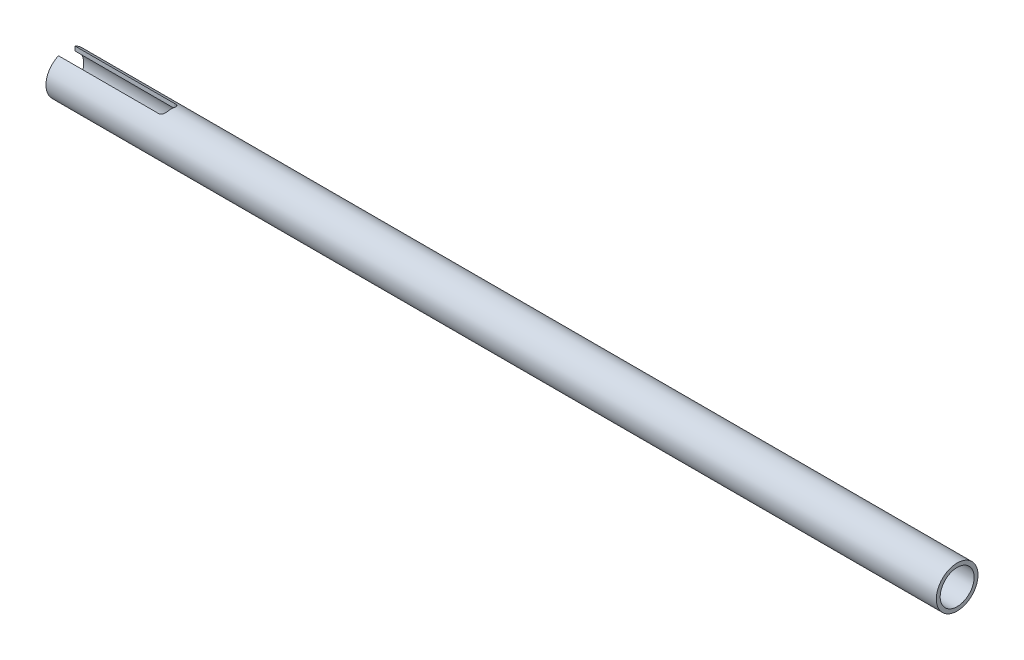
ISO-10303-21;
HEADER;
FILE_DESCRIPTION(('STEP AP214'),'2;1');
FILE_NAME('part.step','',(''),(''),'','','');
FILE_SCHEMA(('AUTOMOTIVE_DESIGN { 1 0 10303 214 1 1 1 1 }'));
ENDSEC;
DATA;
#1=APPLICATION_CONTEXT('core data for automotive mechanical design processes');
#2=APPLICATION_PROTOCOL_DEFINITION('international standard','automotive_design',2000,#1);
#3=PRODUCT_CONTEXT('',#1,'mechanical');
#4=PRODUCT('Part','Part','',(#3));
#5=PRODUCT_RELATED_PRODUCT_CATEGORY('part','',(#4));
#6=PRODUCT_DEFINITION_FORMATION('','',#4);
#7=PRODUCT_DEFINITION_CONTEXT('part definition',#1,'design');
#8=PRODUCT_DEFINITION('design','',#6,#7);
#9=PRODUCT_DEFINITION_SHAPE('','',#8);
#10=(LENGTH_UNIT() NAMED_UNIT(*) SI_UNIT(.MILLI.,.METRE.));
#11=(NAMED_UNIT(*) PLANE_ANGLE_UNIT() SI_UNIT($,.RADIAN.));
#12=(NAMED_UNIT(*) SI_UNIT($,.STERADIAN.) SOLID_ANGLE_UNIT());
#13=UNCERTAINTY_MEASURE_WITH_UNIT(LENGTH_MEASURE(1.E-05),#10,'distance_accuracy_value','');
#14=(GEOMETRIC_REPRESENTATION_CONTEXT(3) GLOBAL_UNCERTAINTY_ASSIGNED_CONTEXT((#13)) GLOBAL_UNIT_ASSIGNED_CONTEXT((#10,
#11,#12)) REPRESENTATION_CONTEXT('',''));
#15=CARTESIAN_POINT('',(0.,0.,0.));
#16=DIRECTION('',(0.,0.,1.));
#17=DIRECTION('',(1.,0.,0.));
#18=AXIS2_PLACEMENT_3D('',#15,#16,#17);
#19=CARTESIAN_POINT('',(-146.220291484198,4.26481936978211E-13,4.76249999999974));
#20=DIRECTION('',(-1.,0.,0.));
#21=DIRECTION('',(0.,-1.,0.));
#22=AXIS2_PLACEMENT_3D('',#19,#20,#21);
#23=PLANE('',#22);
#24=DIRECTION('',(0.,1.,0.));
#25=VECTOR('',#24,1.);
#26=CARTESIAN_POINT('',(-146.220291484198,4.26470921484139E-13,3.17499999999998));
#27=LINE('',#26,#25);
#28=CARTESIAN_POINT('',(-146.220291484198,-7.2748389157424,3.17499999999998));
#29=VERTEX_POINT('',#28);
#30=CARTESIAN_POINT('',(-146.220291484198,-5.63085690548074,3.17499999999998));
#31=VERTEX_POINT('',#30);
#32=EDGE_CURVE('E219',#29,#31,#27,.T.);
#33=ORIENTED_EDGE('',*,*,#32,.F.);
#34=CARTESIAN_POINT('',(-146.220291484198,0.,0.));
#35=DIRECTION('',(-1.,0.,0.));
#36=DIRECTION('',(0.,-1.,0.));
#37=AXIS2_PLACEMENT_3D('',#34,#35,#36);
#38=CIRCLE('',#37,7.9375);
#39=CARTESIAN_POINT('',(-146.220291484198,7.2748389157424,3.17499999999998));
#40=VERTEX_POINT('',#39);
#41=EDGE_CURVE('E202',#40,#29,#38,.F.);
#42=ORIENTED_EDGE('',*,*,#41,.F.);
#43=CARTESIAN_POINT('',(-146.220291484198,5.63085690548074,3.17499999999998));
#44=VERTEX_POINT('',#43);
#45=EDGE_CURVE('E218',#44,#40,#27,.T.);
#46=ORIENTED_EDGE('',*,*,#45,.F.);
#47=CARTESIAN_POINT('',(-146.220291484198,0.,0.));
#48=DIRECTION('',(-1.,0.,0.));
#49=DIRECTION('',(0.,-1.,0.));
#50=AXIS2_PLACEMENT_3D('',#47,#48,#49);
#51=CIRCLE('',#50,6.4643);
#52=EDGE_CURVE('E207',#44,#31,#51,.F.);
#53=ORIENTED_EDGE('',*,*,#52,.T.);
#54=EDGE_LOOP('',(#33,#42,#46,#53));
#55=FACE_BOUND('',#54,.T.);
#56=ADVANCED_FACE('F36',(#55),#23,.T.);
#57=CARTESIAN_POINT('',(215.376382983639,0.,0.));
#58=DIRECTION('',(-1.,0.,0.));
#59=DIRECTION('',(0.,0.,1.));
#60=AXIS2_PLACEMENT_3D('',#57,#58,#59);
#61=CYLINDRICAL_SURFACE('',#60,6.4643);
#62=DIRECTION('',(-1.,0.,0.));
#63=VECTOR('',#62,1.);
#64=CARTESIAN_POINT('',(215.376382983639,5.63085690548063,3.17500000000018));
#65=LINE('',#64,#63);
#66=CARTESIAN_POINT('',(-108.120291484198,5.63085690548071,3.17500000000004));
#67=VERTEX_POINT('',#66);
#68=EDGE_CURVE('E241',#67,#44,#65,.T.);
#69=ORIENTED_EDGE('',*,*,#68,.F.);
#70=CARTESIAN_POINT('',(-106.532791484198,6.26634009929241,1.58749999999999));
#71=CARTESIAN_POINT('',(-106.532791705613,6.25451519937794,1.63418900680278));
#72=CARTESIAN_POINT('',(-106.534851998153,6.2421690242475,1.68071621150091));
#73=CARTESIAN_POINT('',(-106.543000409837,6.21654599792507,1.77313930969813));
#74=CARTESIAN_POINT('',(-106.549086984804,6.20326950527711,1.81903543834437));
#75=CARTESIAN_POINT('',(-106.573197908552,6.16228683989147,1.95507469082073));
#76=CARTESIAN_POINT('',(-106.597074727491,6.13334935224697,2.04387534201678));
#77=CARTESIAN_POINT('',(-106.659359433838,6.07353181019978,2.21532061503982));
#78=CARTESIAN_POINT('',(-106.697751715619,6.04265387160463,2.29797173444355));
#79=CARTESIAN_POINT('',(-106.787986669514,5.98038883139862,2.45546303738965));
#80=CARTESIAN_POINT('',(-106.839839901334,5.94900134826911,2.53029702370296));
#81=CARTESIAN_POINT('',(-106.957963618207,5.88635884745834,2.67287075398235));
#82=CARTESIAN_POINT('',(-107.024687503846,5.85514963173659,2.74025626996524));
#83=CARTESIAN_POINT('',(-107.170024765218,5.79626340236597,2.8627136807605));
#84=CARTESIAN_POINT('',(-107.248638134483,5.76858638679576,2.91778558227087));
#85=CARTESIAN_POINT('',(-107.412860068728,5.72010524984431,3.01168872656632));
#86=CARTESIAN_POINT('',(-107.498102672068,5.69908490291318,3.05104502216778));
#87=CARTESIAN_POINT('',(-107.675503466548,5.66476886814869,3.11430373465248));
#88=CARTESIAN_POINT('',(-107.767643265891,5.65145340907628,3.13824572360379));
#89=CARTESIAN_POINT('',(-107.904136273765,5.63883740321025,3.1608136259935));
#90=CARTESIAN_POINT('',(-107.947145020832,5.63585394797712,3.16612512648619));
#91=CARTESIAN_POINT('',(-108.033523061436,5.63186201493135,3.17321828948634));
#92=CARTESIAN_POINT('',(-108.076892180255,5.63085263040863,3.17500157254314));
#93=CARTESIAN_POINT('',(-108.120291484198,5.63085690548071,3.17500000000004));
#94=B_SPLINE_CURVE_WITH_KNOTS('',3,(#70,#71,#72,#73,#74,#75,#76,#77,#78,#79,#80,#81,#82,#83,#84,
#85,#86,#87,#88,#89,#90,#91,#92,#93),.UNSPECIFIED.,.F.,.F.,(4,2,2,2,2,2,2,2,2,2,2,4),(0.,
0.144388740940306,0.288722137366163,0.57645212892239,0.86387365648992,1.15152134248763,
1.44956694911566,1.74761239362147,2.03464137858761,2.32093052452351,2.45108160789041,
2.58117289753282),.UNSPECIFIED.);
#95=CARTESIAN_POINT('',(-106.532791484198,6.26634009929241,1.58749999999999));
#96=VERTEX_POINT('',#95);
#97=EDGE_CURVE('E265',#96,#67,#94,.T.);
#98=ORIENTED_EDGE('',*,*,#97,.F.);
#99=CARTESIAN_POINT('',(-106.532791484198,0.,0.));
#100=DIRECTION('',(1.,0.,0.));
#101=DIRECTION('',(0.,0.,-1.));
#102=AXIS2_PLACEMENT_3D('',#99,#100,#101);
#103=CIRCLE('',#102,6.4643);
#104=CARTESIAN_POINT('',(-106.532791484198,6.2663400992924,-1.58750000000004));
#105=VERTEX_POINT('',#104);
#106=EDGE_CURVE('E194',#105,#96,#103,.T.);
#107=ORIENTED_EDGE('',*,*,#106,.F.);
#108=CARTESIAN_POINT('',(-108.120291484198,5.63085690548072,-3.17500000000002));
#109=CARTESIAN_POINT('',(-108.079134653522,5.63085243150938,-3.17500265942433));
#110=CARTESIAN_POINT('',(-108.038000131348,5.63176028239596,-3.17339835018607));
#111=CARTESIAN_POINT('',(-107.956074316007,5.6353521570195,-3.16701766507688));
#112=CARTESIAN_POINT('',(-107.915282875166,5.63803537228504,-3.16224273305131));
#113=CARTESIAN_POINT('',(-107.794287648393,5.64863522411122,-3.14329664507894));
#114=CARTESIAN_POINT('',(-107.714975595952,5.65910325483872,-3.12450305374455));
#115=CARTESIAN_POINT('',(-107.561225701454,5.68588522764518,-3.07549165040549));
#116=CARTESIAN_POINT('',(-107.486781241134,5.70219102829141,-3.04528974537459));
#117=CARTESIAN_POINT('',(-107.344113620138,5.73938277272118,-2.97460119282054));
#118=CARTESIAN_POINT('',(-107.275897736247,5.76027397904374,-2.93410271969419));
#119=CARTESIAN_POINT('',(-107.142619767987,5.80676804025648,-2.84103773378418));
#120=CARTESIAN_POINT('',(-107.078073605924,5.83259254506423,-2.78784532739569));
#121=CARTESIAN_POINT('',(-106.958506895887,5.8863178693597,-2.67254263369957));
#122=CARTESIAN_POINT('',(-106.903490815053,5.91421965383984,-2.61042818908349));
#123=CARTESIAN_POINT('',(-106.798473966746,5.9737337168698,-2.47143371409532));
#124=CARTESIAN_POINT('',(-106.74966354719,6.00542032126398,-2.39368295701578));
#125=CARTESIAN_POINT('',(-106.66603614914,6.06785364975221,-2.23068225215675));
#126=CARTESIAN_POINT('',(-106.631212146167,6.09860083846708,-2.14543609512385));
#127=CARTESIAN_POINT('',(-106.580614872534,6.15341243852269,-1.98216120584018));
#128=CARTESIAN_POINT('',(-106.562817961599,6.17780100436403,-1.90486553835023));
#129=CARTESIAN_POINT('',(-106.53888879379,6.22410888754503,-1.74771289593288));
#130=CARTESIAN_POINT('',(-106.532765670706,6.24602625877211,-1.66785396509174));
#131=CARTESIAN_POINT('',(-106.532791484198,6.2663400992924,-1.58750000000004));
#132=B_SPLINE_CURVE_WITH_KNOTS('',3,(#108,#109,#110,#111,#112,#113,#114,#115,#116,#117,#118,
#119,#120,#121,#122,#123,#124,#125,#126,#127,#128,#129,#130,#131),.UNSPECIFIED.,.F.,.F.,(4,2,2,
2,2,2,2,2,2,2,2,4),(0.,0.123386261727179,0.246716374037834,0.4919349801057,0.73681292470185,
0.981973392060174,1.24352761602778,1.50520411142378,1.7952497086635,2.08514945193375,
2.33322496948234,2.58149450643048),.UNSPECIFIED.);
#133=CARTESIAN_POINT('',(-108.120291484198,5.63085690548072,-3.17500000000002));
#134=VERTEX_POINT('',#133);
#135=EDGE_CURVE('E193',#134,#105,#132,.T.);
#136=ORIENTED_EDGE('',*,*,#135,.F.);
#137=DIRECTION('',(-1.,0.,0.));
#138=VECTOR('',#137,1.);
#139=CARTESIAN_POINT('',(215.376382983639,5.63085690548071,-3.17500000000003));
#140=LINE('',#139,#138);
#141=CARTESIAN_POINT('',(-146.220291484198,5.63085690548071,-3.17500000000003));
#142=VERTEX_POINT('',#141);
#143=EDGE_CURVE('E140',#142,#134,#140,.F.);
#144=ORIENTED_EDGE('',*,*,#143,.F.);
#145=CARTESIAN_POINT('',(-146.220291484198,-5.63085690548071,-3.17500000000003));
#146=VERTEX_POINT('',#145);
#147=EDGE_CURVE('E203',#146,#142,#51,.F.);
#148=ORIENTED_EDGE('',*,*,#147,.F.);
#149=DIRECTION('',(-1.,0.,0.));
#150=VECTOR('',#149,1.);
#151=CARTESIAN_POINT('',(215.376382983639,-5.63085690548071,-3.17500000000003));
#152=LINE('',#151,#150);
#153=CARTESIAN_POINT('',(-108.120291484198,-5.63085690548072,-3.17500000000002));
#154=VERTEX_POINT('',#153);
#155=EDGE_CURVE('E57',#154,#146,#152,.T.);
#156=ORIENTED_EDGE('',*,*,#155,.F.);
#157=CARTESIAN_POINT('',(-106.532791484198,-6.2663400992924,-1.58750000000004));
#158=CARTESIAN_POINT('',(-106.532791705613,-6.25451519937793,-1.63418900680283));
#159=CARTESIAN_POINT('',(-106.534851998153,-6.24216902424749,-1.68071621150095));
#160=CARTESIAN_POINT('',(-106.543000409837,-6.21654599792506,-1.77313930969817));
#161=CARTESIAN_POINT('',(-106.549086984804,-6.2032695052771,-1.81903543834441));
#162=CARTESIAN_POINT('',(-106.573197908552,-6.16228683989146,-1.95507469082076));
#163=CARTESIAN_POINT('',(-106.597074727491,-6.13334935224696,-2.04387534201681));
#164=CARTESIAN_POINT('',(-106.659359433838,-6.07353181019977,-2.21532061503985));
#165=CARTESIAN_POINT('',(-106.697751715619,-6.04265387160462,-2.29797173444357));
#166=CARTESIAN_POINT('',(-106.787986669514,-5.98038883139862,-2.45546303738966));
#167=CARTESIAN_POINT('',(-106.839839901334,-5.94900134826911,-2.53029702370297));
#168=CARTESIAN_POINT('',(-106.957963618207,-5.88635884745834,-2.67287075398236));
#169=CARTESIAN_POINT('',(-107.024687503846,-5.85514963173658,-2.74025626996525));
#170=CARTESIAN_POINT('',(-107.170024765218,-5.79626340236596,-2.86271368076051));
#171=CARTESIAN_POINT('',(-107.248638134483,-5.76858638679576,-2.91778558227087));
#172=CARTESIAN_POINT('',(-107.412860068728,-5.72010524984431,-3.01168872656631));
#173=CARTESIAN_POINT('',(-107.498102672069,-5.69908490291318,-3.05104502216777));
#174=CARTESIAN_POINT('',(-107.675503466548,-5.6647688681487,-3.11430373465247));
#175=CARTESIAN_POINT('',(-107.767643265891,-5.65145340907629,-3.13824572360378));
#176=CARTESIAN_POINT('',(-107.904136273765,-5.63883740321026,-3.16081362599348));
#177=CARTESIAN_POINT('',(-107.947145020832,-5.63585394797714,-3.16612512648617));
#178=CARTESIAN_POINT('',(-108.033523061436,-5.63186201493137,-3.17321828948632));
#179=CARTESIAN_POINT('',(-108.076892180255,-5.63085263040864,-3.17500157254311));
#180=CARTESIAN_POINT('',(-108.120291484198,-5.63085690548072,-3.17500000000002));
#181=B_SPLINE_CURVE_WITH_KNOTS('',3,(#157,#158,#159,#160,#161,#162,#163,#164,#165,#166,#167,
#168,#169,#170,#171,#172,#173,#174,#175,#176,#177,#178,#179,#180),.UNSPECIFIED.,.F.,.F.,(4,2,2,
2,2,2,2,2,2,2,2,4),(0.,0.144388740940297,0.28872213736615,0.57645212892237,0.86387365648989,
1.15152134248759,1.44956694911561,1.74761239362141,2.03464137858755,2.32093052452343,
2.4510816078903,2.58117289753264),.UNSPECIFIED.);
#182=CARTESIAN_POINT('',(-106.532791484198,-6.2663400992924,-1.58750000000004));
#183=VERTEX_POINT('',#182);
#184=EDGE_CURVE('E148',#183,#154,#181,.T.);
#185=ORIENTED_EDGE('',*,*,#184,.F.);
#186=CARTESIAN_POINT('',(-106.532791484198,-6.26634009929241,1.58749999999999));
#187=VERTEX_POINT('',#186);
#188=EDGE_CURVE('E195',#187,#183,#103,.T.);
#189=ORIENTED_EDGE('',*,*,#188,.F.);
#190=CARTESIAN_POINT('',(-108.120291484198,-5.63085690548071,3.17500000000004));
#191=CARTESIAN_POINT('',(-108.079134653523,-5.63085243150937,3.17500265942435));
#192=CARTESIAN_POINT('',(-108.038000131348,-5.63176028239594,3.1733983501861));
#193=CARTESIAN_POINT('',(-107.956074316008,-5.63535215701948,3.16701766507691));
#194=CARTESIAN_POINT('',(-107.915282875166,-5.63803537228502,3.16224273305134));
#195=CARTESIAN_POINT('',(-107.794287648393,-5.64863522411121,3.14329664507898));
#196=CARTESIAN_POINT('',(-107.714975595952,-5.6591032548387,3.12450305374459));
#197=CARTESIAN_POINT('',(-107.561225701454,-5.68588522764515,3.07549165040553));
#198=CARTESIAN_POINT('',(-107.486781241134,-5.70219102829139,3.04528974537463));
#199=CARTESIAN_POINT('',(-107.344113620138,-5.73938277272116,2.97460119282059));
#200=CARTESIAN_POINT('',(-107.275897736247,-5.76027397904372,2.93410271969424));
#201=CARTESIAN_POINT('',(-107.142619767987,-5.80676804025645,2.84103773378424));
#202=CARTESIAN_POINT('',(-107.078073605925,-5.8325925450642,2.78784532739575));
#203=CARTESIAN_POINT('',(-106.958506895887,-5.88631786935967,2.67254263369964));
#204=CARTESIAN_POINT('',(-106.903490815053,-5.91421965383981,2.61042818908355));
#205=CARTESIAN_POINT('',(-106.798473966746,-5.97373371686977,2.47143371409538));
#206=CARTESIAN_POINT('',(-106.74966354719,-6.00542032126395,2.39368295701585));
#207=CARTESIAN_POINT('',(-106.66603614914,-6.06785364975219,2.23068225215682));
#208=CARTESIAN_POINT('',(-106.631212146167,-6.09860083846706,2.14543609512392));
#209=CARTESIAN_POINT('',(-106.580614872534,-6.15341243852268,1.98216120584023));
#210=CARTESIAN_POINT('',(-106.562817961599,-6.17780100436402,1.90486553835026));
#211=CARTESIAN_POINT('',(-106.53888879379,-6.22410888754503,1.74771289593288));
#212=CARTESIAN_POINT('',(-106.532765670706,-6.24602625877211,1.66785396509171));
#213=CARTESIAN_POINT('',(-106.532791484198,-6.26634009929241,1.58749999999999));
#214=B_SPLINE_CURVE_WITH_KNOTS('',3,(#190,#191,#192,#193,#194,#195,#196,#197,#198,#199,#200,
#201,#202,#203,#204,#205,#206,#207,#208,#209,#210,#211,#212,#213),.UNSPECIFIED.,.F.,.F.,(4,2,2,
2,2,2,2,2,2,2,2,4),(0.,0.123386261727165,0.246716374037833,0.491934980105711,0.736812924701871,
0.981973392060188,1.24352761602779,1.5052041114238,1.79524970866353,2.08514945193379,
2.33322496948244,2.58149450643065),.UNSPECIFIED.);
#215=CARTESIAN_POINT('',(-108.120291484198,-5.63085690548071,3.17500000000004));
#216=VERTEX_POINT('',#215);
#217=EDGE_CURVE('E240',#216,#187,#214,.T.);
#218=ORIENTED_EDGE('',*,*,#217,.F.);
#219=DIRECTION('',(-1.,0.,0.));
#220=VECTOR('',#219,1.);
#221=CARTESIAN_POINT('',(215.376382983639,-5.63085690548063,3.17500000000018));
#222=LINE('',#221,#220);
#223=EDGE_CURVE('E227',#31,#216,#222,.F.);
#224=ORIENTED_EDGE('',*,*,#223,.F.);
#225=ORIENTED_EDGE('',*,*,#52,.F.);
#226=EDGE_LOOP('',(#69,#98,#107,#136,#144,#148,#156,#185,#189,#218,#224,#225));
#227=FACE_BOUND('',#226,.T.);
#228=CARTESIAN_POINT('',(192.925742680966,-3.43327840116037E-13,0.));
#229=DIRECTION('',(-1.,0.,0.));
#230=DIRECTION('',(0.,-1.,0.));
#231=AXIS2_PLACEMENT_3D('',#228,#229,#230);
#232=CIRCLE('',#231,6.4643);
#233=CARTESIAN_POINT('',(192.925742680966,-6.46430000000034,0.));
#234=VERTEX_POINT('',#233);
#235=EDGE_CURVE('E206',#234,#234,#232,.T.);
#236=ORIENTED_EDGE('',*,*,#235,.F.);
#237=EDGE_LOOP('',(#236));
#238=FACE_BOUND('',#237,.T.);
#239=ADVANCED_FACE('F38',(#227,#238),#61,.F.);
#240=CARTESIAN_POINT('',(215.376382983639,0.,0.));
#241=DIRECTION('',(-1.,0.,0.));
#242=DIRECTION('',(0.,0.,1.));
#243=AXIS2_PLACEMENT_3D('',#240,#241,#242);
#244=CYLINDRICAL_SURFACE('',#243,7.9375);
#245=CARTESIAN_POINT('',(-146.220291484198,-7.27483891574238,-3.17500000000003));
#246=VERTEX_POINT('',#245);
#247=CARTESIAN_POINT('',(-146.220291484198,7.27483891574238,-3.17500000000003));
#248=VERTEX_POINT('',#247);
#249=EDGE_CURVE('E210',#246,#248,#38,.F.);
#250=ORIENTED_EDGE('',*,*,#249,.T.);
#251=DIRECTION('',(-1.,0.,0.));
#252=VECTOR('',#251,1.);
#253=CARTESIAN_POINT('',(215.376382983639,7.27483891574238,-3.17500000000003));
#254=LINE('',#253,#252);
#255=CARTESIAN_POINT('',(-108.120291484198,7.27483891574239,-3.17500000000002));
#256=VERTEX_POINT('',#255);
#257=EDGE_CURVE('E65',#248,#256,#254,.F.);
#258=ORIENTED_EDGE('',*,*,#257,.T.);
#259=CARTESIAN_POINT('',(-108.120291484198,7.27483891574239,-3.17500000000002));
#260=CARTESIAN_POINT('',(-108.077919932215,7.27483586366097,-3.1750016811366));
#261=CARTESIAN_POINT('',(-108.035570236552,7.27558001702575,-3.1733024516557));
#262=CARTESIAN_POINT('',(-107.951204422082,7.27852818539399,-3.1665366187788));
#263=CARTESIAN_POINT('',(-107.909188206701,7.28073176088511,-3.1614710291776));
#264=CARTESIAN_POINT('',(-107.784405848686,7.28945465778901,-3.1413345016341));
#265=CARTESIAN_POINT('',(-107.702525529596,7.29808678684577,-3.12132308750015));
#266=CARTESIAN_POINT('',(-107.543667641596,7.32026684625099,-3.06894040253672));
#267=CARTESIAN_POINT('',(-107.466686666408,7.3338113164125,-3.03657783085927));
#268=CARTESIAN_POINT('',(-107.319294086033,7.36480545430106,-2.96061234627713));
#269=CARTESIAN_POINT('',(-107.248887229192,7.38225791423853,-2.91700139314276));
#270=CARTESIAN_POINT('',(-107.113212940324,7.42075264717218,-2.81767453343911));
#271=CARTESIAN_POINT('',(-107.048311930561,7.4419198014486,-2.76150754869696));
#272=CARTESIAN_POINT('',(-106.928626406856,7.48594933347428,-2.639820816105));
#273=CARTESIAN_POINT('',(-106.873845894839,7.50881237683835,-2.57429738653617));
#274=CARTESIAN_POINT('',(-106.772168507767,7.55656843444931,-2.43069507728348));
#275=CARTESIAN_POINT('',(-106.726063978792,7.5814935593788,-2.352064708262));
#276=CARTESIAN_POINT('',(-106.647898374593,7.63048866953837,-2.18789362747874));
#277=CARTESIAN_POINT('',(-106.615829887986,7.65455909988383,-2.10235659094257));
#278=CARTESIAN_POINT('',(-106.572004893213,7.6957350743198,-1.94541809174967));
#279=CARTESIAN_POINT('',(-106.557369788367,7.71322855066072,-1.87491037842446));
#280=CARTESIAN_POINT('',(-106.537754026514,7.74654000063456,-1.7321911340129));
#281=CARTESIAN_POINT('',(-106.53277219555,7.76235817778307,-1.65997981118747));
#282=CARTESIAN_POINT('',(-106.532791484198,7.77712993333658,-1.58750000000004));
#283=B_SPLINE_CURVE_WITH_KNOTS('',3,(#259,#260,#261,#262,#263,#264,#265,#266,#267,#268,#269,
#270,#271,#272,#273,#274,#275,#276,#277,#278,#279,#280,#281,#282),.UNSPECIFIED.,.F.,.F.,(4,2,2,
2,2,2,2,2,2,2,2,4),(0.,0.127031494291915,0.254024749792394,0.506885265042638,0.759568013575109,
1.01243188015948,1.27651034681329,1.54069301498297,1.82289095795801,2.10493971303589,
2.32661111398094,2.54825555529023),.UNSPECIFIED.);
#284=CARTESIAN_POINT('',(-106.532791484198,7.77712993333658,-1.58750000000004));
#285=VERTEX_POINT('',#284);
#286=EDGE_CURVE('E12',#256,#285,#283,.T.);
#287=ORIENTED_EDGE('',*,*,#286,.T.);
#288=CARTESIAN_POINT('',(-106.532791484198,0.,0.));
#289=DIRECTION('',(1.,0.,0.));
#290=DIRECTION('',(0.,0.,-1.));
#291=AXIS2_PLACEMENT_3D('',#288,#289,#290);
#292=CIRCLE('',#291,7.9375);
#293=CARTESIAN_POINT('',(-106.532791484198,7.77712993333659,1.58749999999999));
#294=VERTEX_POINT('',#293);
#295=EDGE_CURVE('E159',#285,#294,#292,.T.);
#296=ORIENTED_EDGE('',*,*,#295,.T.);
#297=CARTESIAN_POINT('',(-106.532791484198,7.77712993333659,1.58749999999999));
#298=CARTESIAN_POINT('',(-106.532791727788,7.76774126330065,1.63350676862772));
#299=CARTESIAN_POINT('',(-106.534792388905,7.75794444810862,1.67940359564176));
#300=CARTESIAN_POINT('',(-106.542729752223,7.73762089991974,1.77068039580911));
#301=CARTESIAN_POINT('',(-106.548665420972,7.72709435922088,1.81606050148704));
#302=CARTESIAN_POINT('',(-106.572238370223,7.6945984520111,1.95078228156833));
#303=CARTESIAN_POINT('',(-106.595642317145,7.67166299368629,2.03894812030823));
#304=CARTESIAN_POINT('',(-106.656922514317,7.62428385726794,2.20953807004377));
#305=CARTESIAN_POINT('',(-106.694791204576,7.59984097261638,2.29196515383516));
#306=CARTESIAN_POINT('',(-106.783938474618,7.55064502184106,2.44917385980106));
#307=CARTESIAN_POINT('',(-106.835222642063,7.52589183057164,2.523952278145));
#308=CARTESIAN_POINT('',(-106.951209690018,7.47696931777062,2.66543932718695));
#309=CARTESIAN_POINT('',(-107.016178415134,7.45282414598359,2.73193883493115));
#310=CARTESIAN_POINT('',(-107.157316628967,7.40732925012121,2.85299322074863));
#311=CARTESIAN_POINT('',(-107.233486512298,7.38597962458241,2.90754767783195));
#312=CARTESIAN_POINT('',(-107.393060212782,7.34825600672413,3.00159155783958));
#313=CARTESIAN_POINT('',(-107.476234668043,7.33177064627853,3.04142452291155));
#314=CARTESIAN_POINT('',(-107.649005300143,7.30455577634142,3.1062233026933));
#315=CARTESIAN_POINT('',(-107.738590177312,7.29381640854948,3.13121458917048));
#316=CARTESIAN_POINT('',(-107.877637997079,7.2826300403174,3.15710194076304));
#317=CARTESIAN_POINT('',(-107.92589322392,7.27971714426162,3.16380495831032));
#318=CARTESIAN_POINT('',(-108.022852642349,7.27581937849738,3.17275416759988));
#319=CARTESIAN_POINT('',(-108.071556443267,7.27483296598245,3.1750039257132));
#320=CARTESIAN_POINT('',(-108.120291484198,7.27483891574238,3.17500000000004));
#321=B_SPLINE_CURVE_WITH_KNOTS('',3,(#297,#298,#299,#300,#301,#302,#303,#304,#305,#306,#307,
#308,#309,#310,#311,#312,#313,#314,#315,#316,#317,#318,#319,#320),.UNSPECIFIED.,.F.,.F.,(4,2,2,
2,2,2,2,2,2,2,2,4),(0.,0.140770845296607,0.281504734514015,0.562238948643045,0.842826637517791,
1.12353138019528,1.41029752992664,1.69707378478453,1.97665708187312,2.25575915194306,
2.40195937855949,2.54804247399305),.UNSPECIFIED.);
#322=CARTESIAN_POINT('',(-108.120291484198,7.27483891574238,3.17500000000004));
#323=VERTEX_POINT('',#322);
#324=EDGE_CURVE('E157',#294,#323,#321,.T.);
#325=ORIENTED_EDGE('',*,*,#324,.T.);
#326=DIRECTION('',(-1.,0.,0.));
#327=VECTOR('',#326,1.);
#328=CARTESIAN_POINT('',(215.376382983639,7.27483891574232,3.17500000000018));
#329=LINE('',#328,#327);
#330=EDGE_CURVE('E242',#323,#40,#329,.T.);
#331=ORIENTED_EDGE('',*,*,#330,.T.);
#332=ORIENTED_EDGE('',*,*,#41,.T.);
#333=DIRECTION('',(-1.,0.,0.));
#334=VECTOR('',#333,1.);
#335=CARTESIAN_POINT('',(215.376382983639,-7.27483891574232,3.17500000000018));
#336=LINE('',#335,#334);
#337=CARTESIAN_POINT('',(-108.120291484198,-7.27483891574238,3.17500000000004));
#338=VERTEX_POINT('',#337);
#339=EDGE_CURVE('E230',#29,#338,#336,.F.);
#340=ORIENTED_EDGE('',*,*,#339,.T.);
#341=CARTESIAN_POINT('',(-108.120291484198,-7.27483891574238,3.17500000000004));
#342=CARTESIAN_POINT('',(-108.077919932215,-7.27483586366096,3.17500168113663));
#343=CARTESIAN_POINT('',(-108.035570236552,-7.27558001702574,3.17330245165573));
#344=CARTESIAN_POINT('',(-107.951204422082,-7.27852818539398,3.16653661877883));
#345=CARTESIAN_POINT('',(-107.909188206701,-7.28073176088509,3.16147102917763));
#346=CARTESIAN_POINT('',(-107.784405848686,-7.28945465778899,3.14133450163413));
#347=CARTESIAN_POINT('',(-107.702525529596,-7.29808678684575,3.12132308750019));
#348=CARTESIAN_POINT('',(-107.543667641596,-7.32026684625097,3.06894040253676));
#349=CARTESIAN_POINT('',(-107.466686666408,-7.33381131641248,3.03657783085932));
#350=CARTESIAN_POINT('',(-107.319294086033,-7.36480545430104,2.96061234627719));
#351=CARTESIAN_POINT('',(-107.248887229192,-7.38225791423851,2.91700139314283));
#352=CARTESIAN_POINT('',(-107.113212940324,-7.42075264717215,2.81767453343918));
#353=CARTESIAN_POINT('',(-107.048311930561,-7.44191980144857,2.76150754869704));
#354=CARTESIAN_POINT('',(-106.928626406856,-7.48594933347425,2.63982081610508));
#355=CARTESIAN_POINT('',(-106.87384589484,-7.50881237683833,2.57429738653625));
#356=CARTESIAN_POINT('',(-106.772168507767,-7.55656843444928,2.43069507728357));
#357=CARTESIAN_POINT('',(-106.726063978792,-7.58149355937877,2.35206470826208));
#358=CARTESIAN_POINT('',(-106.647898374593,-7.63048866953835,2.18789362747882));
#359=CARTESIAN_POINT('',(-106.615829887986,-7.65455909988381,2.10235659094264));
#360=CARTESIAN_POINT('',(-106.572004893213,-7.69573507431979,1.94541809174972));
#361=CARTESIAN_POINT('',(-106.557369788367,-7.71322855066071,1.87491037842449));
#362=CARTESIAN_POINT('',(-106.537754026513,-7.74654000063457,1.73219113401289));
#363=CARTESIAN_POINT('',(-106.53277219555,-7.76235817778308,1.65997981118744));
#364=CARTESIAN_POINT('',(-106.532791484198,-7.77712993333659,1.58749999999999));
#365=B_SPLINE_CURVE_WITH_KNOTS('',3,(#341,#342,#343,#344,#345,#346,#347,#348,#349,#350,#351,
#352,#353,#354,#355,#356,#357,#358,#359,#360,#361,#362,#363,#364),.UNSPECIFIED.,.F.,.F.,(4,2,2,
2,2,2,2,2,2,2,2,4),(0.,0.127031494291915,0.254024749792393,0.506885265042634,0.759568013575098,
1.01243188015947,1.27651034681329,1.54069301498297,1.82289095795803,2.10493971303593,
2.32661111398104,2.54825555529039),.UNSPECIFIED.);
#366=CARTESIAN_POINT('',(-106.532791484198,-7.77712993333659,1.58749999999999));
#367=VERTEX_POINT('',#366);
#368=EDGE_CURVE('E50',#338,#367,#365,.T.);
#369=ORIENTED_EDGE('',*,*,#368,.T.);
#370=CARTESIAN_POINT('',(-106.532791484198,-7.77712993333658,-1.58750000000004));
#371=VERTEX_POINT('',#370);
#372=EDGE_CURVE('E155',#367,#371,#292,.T.);
#373=ORIENTED_EDGE('',*,*,#372,.T.);
#374=CARTESIAN_POINT('',(-106.532791484198,-7.77712993333658,-1.58750000000004));
#375=CARTESIAN_POINT('',(-106.532791727788,-7.76774126330064,-1.63350676862776));
#376=CARTESIAN_POINT('',(-106.534792388905,-7.75794444810861,-1.6794035956418));
#377=CARTESIAN_POINT('',(-106.542729752223,-7.73762089991973,-1.77068039580915));
#378=CARTESIAN_POINT('',(-106.548665420972,-7.72709435922087,-1.81606050148708));
#379=CARTESIAN_POINT('',(-106.572238370223,-7.69459845201109,-1.95078228156836));
#380=CARTESIAN_POINT('',(-106.595642317145,-7.67166299368629,-2.03894812030826));
#381=CARTESIAN_POINT('',(-106.656922514317,-7.62428385726793,-2.20953807004379));
#382=CARTESIAN_POINT('',(-106.694791204576,-7.59984097261637,-2.29196515383518));
#383=CARTESIAN_POINT('',(-106.783938474618,-7.55064502184106,-2.44917385980108));
#384=CARTESIAN_POINT('',(-106.835222642063,-7.52589183057164,-2.52395227814501));
#385=CARTESIAN_POINT('',(-106.951209690018,-7.47696931777061,-2.66543932718696));
#386=CARTESIAN_POINT('',(-107.016178415134,-7.45282414598359,-2.73193883493115));
#387=CARTESIAN_POINT('',(-107.157316628967,-7.40732925012121,-2.85299322074863));
#388=CARTESIAN_POINT('',(-107.233486512298,-7.38597962458242,-2.90754767783194));
#389=CARTESIAN_POINT('',(-107.393060212782,-7.34825600672414,-3.00159155783957));
#390=CARTESIAN_POINT('',(-107.476234668043,-7.33177064627854,-3.04142452291154));
#391=CARTESIAN_POINT('',(-107.649005300143,-7.30455577634142,-3.10622330269328));
#392=CARTESIAN_POINT('',(-107.738590177312,-7.29381640854949,-3.13121458917047));
#393=CARTESIAN_POINT('',(-107.877637997079,-7.2826300403174,-3.15710194076302));
#394=CARTESIAN_POINT('',(-107.92589322392,-7.27971714426163,-3.1638049583103));
#395=CARTESIAN_POINT('',(-108.022852642349,-7.27581937849739,-3.17275416759986));
#396=CARTESIAN_POINT('',(-108.071556443267,-7.27483296598246,-3.17500392571318));
#397=CARTESIAN_POINT('',(-108.120291484198,-7.27483891574239,-3.17500000000002));
#398=B_SPLINE_CURVE_WITH_KNOTS('',3,(#374,#375,#376,#377,#378,#379,#380,#381,#382,#383,#384,
#385,#386,#387,#388,#389,#390,#391,#392,#393,#394,#395,#396,#397),.UNSPECIFIED.,.F.,.F.,(4,2,2,
2,2,2,2,2,2,2,2,4),(0.,0.140770845296601,0.281504734514003,0.562238948643023,0.842826637517759,
1.12353138019524,1.4102975299266,1.69707378478446,1.97665708187304,2.25575915194298,
2.40195937855936,2.54804247399287),.UNSPECIFIED.);
#399=CARTESIAN_POINT('',(-108.120291484198,-7.27483891574239,-3.17500000000002));
#400=VERTEX_POINT('',#399);
#401=EDGE_CURVE('E145',#371,#400,#398,.T.);
#402=ORIENTED_EDGE('',*,*,#401,.T.);
#403=DIRECTION('',(-1.,0.,0.));
#404=VECTOR('',#403,1.);
#405=CARTESIAN_POINT('',(215.376382983639,-7.27483891574238,-3.17500000000003));
#406=LINE('',#405,#404);
#407=EDGE_CURVE('E131',#400,#246,#406,.T.);
#408=ORIENTED_EDGE('',*,*,#407,.T.);
#409=EDGE_LOOP('',(#250,#258,#287,#296,#325,#331,#332,#340,#369,#373,#402,#408));
#410=FACE_BOUND('',#409,.T.);
#411=CARTESIAN_POINT('',(192.925742680966,-3.43327840116037E-13,0.));
#412=DIRECTION('',(-1.,0.,0.));
#413=DIRECTION('',(0.,-1.,0.));
#414=AXIS2_PLACEMENT_3D('',#411,#412,#413);
#415=CIRCLE('',#414,7.9375);
#416=CARTESIAN_POINT('',(192.925742680966,-7.93750000000034,0.));
#417=VERTEX_POINT('',#416);
#418=EDGE_CURVE('E213',#417,#417,#415,.T.);
#419=ORIENTED_EDGE('',*,*,#418,.T.);
#420=EDGE_LOOP('',(#419));
#421=FACE_BOUND('',#420,.T.);
#422=ADVANCED_FACE('F152',(#410,#421),#244,.T.);
#423=CARTESIAN_POINT('',(192.925742680966,-3.43327840116037E-13,0.));
#424=DIRECTION('',(-1.,0.,0.));
#425=DIRECTION('',(0.,-1.,0.));
#426=AXIS2_PLACEMENT_3D('',#423,#424,#425);
#427=PLANE('',#426);
#428=ORIENTED_EDGE('',*,*,#235,.T.);
#429=EDGE_LOOP('',(#428));
#430=FACE_BOUND('',#429,.T.);
#431=ORIENTED_EDGE('',*,*,#418,.F.);
#432=EDGE_LOOP('',(#431));
#433=FACE_BOUND('',#432,.T.);
#434=ADVANCED_FACE('F284',(#430,#433),#427,.F.);
#435=DIRECTION('',(0.,-1.,0.));
#436=VECTOR('',#435,1.);
#437=CARTESIAN_POINT('',(-146.220291484198,4.26426859507849E-13,-3.17500000000003));
#438=LINE('',#437,#436);
#439=EDGE_CURVE('E217',#248,#142,#438,.T.);
#440=ORIENTED_EDGE('',*,*,#439,.F.);
#441=ORIENTED_EDGE('',*,*,#249,.F.);
#442=EDGE_CURVE('E135',#146,#246,#438,.T.);
#443=ORIENTED_EDGE('',*,*,#442,.F.);
#444=ORIENTED_EDGE('',*,*,#147,.T.);
#445=EDGE_LOOP('',(#440,#441,#443,#444));
#446=FACE_BOUND('',#445,.T.);
#447=ADVANCED_FACE('F246',(#446),#23,.T.);
#448=CARTESIAN_POINT('',(-108.120291484198,-7.93750000000036,-3.17500000000003));
#449=DIRECTION('',(0.,0.,-1.));
#450=DIRECTION('',(0.,1.,0.));
#451=AXIS2_PLACEMENT_3D('',#448,#449,#450);
#452=PLANE('',#451);
#453=ORIENTED_EDGE('',*,*,#155,.T.);
#454=ORIENTED_EDGE('',*,*,#442,.T.);
#455=ORIENTED_EDGE('',*,*,#407,.F.);
#456=DIRECTION('',(0.,1.,0.));
#457=VECTOR('',#456,1.);
#458=CARTESIAN_POINT('',(-108.120291484198,-7.93750000000036,-3.17500000000002));
#459=LINE('',#458,#457);
#460=EDGE_CURVE('E134',#400,#154,#459,.T.);
#461=ORIENTED_EDGE('',*,*,#460,.T.);
#462=EDGE_LOOP('',(#453,#454,#455,#461));
#463=FACE_BOUND('',#462,.T.);
#464=ADVANCED_FACE('F133',(#463),#452,.F.);
#465=CARTESIAN_POINT('',(-146.220291484198,-7.93750000000036,3.17499999999998));
#466=DIRECTION('',(0.,0.,1.));
#467=DIRECTION('',(1.,0.,0.));
#468=AXIS2_PLACEMENT_3D('',#465,#466,#467);
#469=PLANE('',#468);
#470=ORIENTED_EDGE('',*,*,#223,.T.);
#471=DIRECTION('',(0.,1.,0.));
#472=VECTOR('',#471,1.);
#473=CARTESIAN_POINT('',(-108.120291484198,-7.93750000000036,3.17500000000004));
#474=LINE('',#473,#472);
#475=EDGE_CURVE('E394',#338,#216,#474,.T.);
#476=ORIENTED_EDGE('',*,*,#475,.F.);
#477=ORIENTED_EDGE('',*,*,#339,.F.);
#478=ORIENTED_EDGE('',*,*,#32,.T.);
#479=EDGE_LOOP('',(#470,#476,#477,#478));
#480=FACE_BOUND('',#479,.T.);
#481=ADVANCED_FACE('F225',(#480),#469,.F.);
#482=CARTESIAN_POINT('',(-108.120291484198,-7.93750000000036,1.5875));
#483=DIRECTION('',(0.,1.,0.));
#484=DIRECTION('',(-1.,0.,0.));
#485=AXIS2_PLACEMENT_3D('',#482,#483,#484);
#486=CYLINDRICAL_SURFACE('',#485,1.58750000000004);
#487=ORIENTED_EDGE('',*,*,#217,.T.);
#488=DIRECTION('',(0.,1.,0.));
#489=VECTOR('',#488,1.);
#490=CARTESIAN_POINT('',(-106.532791484198,-7.93750000000036,1.58749999999999));
#491=LINE('',#490,#489);
#492=EDGE_CURVE('E393',#367,#187,#491,.T.);
#493=ORIENTED_EDGE('',*,*,#492,.F.);
#494=ORIENTED_EDGE('',*,*,#368,.F.);
#495=ORIENTED_EDGE('',*,*,#475,.T.);
#496=EDGE_LOOP('',(#487,#493,#494,#495));
#497=FACE_BOUND('',#496,.T.);
#498=ADVANCED_FACE('F276',(#497),#486,.F.);
#499=CARTESIAN_POINT('',(-106.532791484198,-7.93750000000036,1.58749999999999));
#500=DIRECTION('',(1.,0.,0.));
#501=DIRECTION('',(0.,0.,-1.));
#502=AXIS2_PLACEMENT_3D('',#499,#500,#501);
#503=PLANE('',#502);
#504=ORIENTED_EDGE('',*,*,#188,.T.);
#505=DIRECTION('',(0.,1.,0.));
#506=VECTOR('',#505,1.);
#507=CARTESIAN_POINT('',(-106.532791484198,-7.93750000000036,-1.58750000000004));
#508=LINE('',#507,#506);
#509=EDGE_CURVE('E397',#371,#183,#508,.T.);
#510=ORIENTED_EDGE('',*,*,#509,.F.);
#511=ORIENTED_EDGE('',*,*,#372,.F.);
#512=ORIENTED_EDGE('',*,*,#492,.T.);
#513=EDGE_LOOP('',(#504,#510,#511,#512));
#514=FACE_BOUND('',#513,.T.);
#515=ADVANCED_FACE('F332',(#514),#503,.F.);
#516=CARTESIAN_POINT('',(-108.120291484198,-7.93750000000036,-1.58750000000004));
#517=DIRECTION('',(0.,1.,0.));
#518=DIRECTION('',(-1.,0.,0.));
#519=AXIS2_PLACEMENT_3D('',#516,#517,#518);
#520=CYLINDRICAL_SURFACE('',#519,1.58749999999998);
#521=ORIENTED_EDGE('',*,*,#184,.T.);
#522=ORIENTED_EDGE('',*,*,#460,.F.);
#523=ORIENTED_EDGE('',*,*,#401,.F.);
#524=ORIENTED_EDGE('',*,*,#509,.T.);
#525=EDGE_LOOP('',(#521,#522,#523,#524));
#526=FACE_BOUND('',#525,.T.);
#527=ADVANCED_FACE('F143',(#526),#520,.F.);
#528=ORIENTED_EDGE('',*,*,#135,.T.);
#529=EDGE_CURVE('E389',#105,#285,#508,.T.);
#530=ORIENTED_EDGE('',*,*,#529,.T.);
#531=ORIENTED_EDGE('',*,*,#286,.F.);
#532=EDGE_CURVE('E149',#134,#256,#459,.T.);
#533=ORIENTED_EDGE('',*,*,#532,.F.);
#534=EDGE_LOOP('',(#528,#530,#531,#533));
#535=FACE_BOUND('',#534,.T.);
#536=ADVANCED_FACE('F176',(#535),#520,.F.);
#537=ORIENTED_EDGE('',*,*,#106,.T.);
#538=EDGE_CURVE('E387',#96,#294,#491,.T.);
#539=ORIENTED_EDGE('',*,*,#538,.T.);
#540=ORIENTED_EDGE('',*,*,#295,.F.);
#541=ORIENTED_EDGE('',*,*,#529,.F.);
#542=EDGE_LOOP('',(#537,#539,#540,#541));
#543=FACE_BOUND('',#542,.T.);
#544=ADVANCED_FACE('F181',(#543),#503,.F.);
#545=ORIENTED_EDGE('',*,*,#97,.T.);
#546=EDGE_CURVE('E401',#67,#323,#474,.T.);
#547=ORIENTED_EDGE('',*,*,#546,.T.);
#548=ORIENTED_EDGE('',*,*,#324,.F.);
#549=ORIENTED_EDGE('',*,*,#538,.F.);
#550=EDGE_LOOP('',(#545,#547,#548,#549));
#551=FACE_BOUND('',#550,.T.);
#552=ADVANCED_FACE('F270',(#551),#486,.F.);
#553=ORIENTED_EDGE('',*,*,#68,.T.);
#554=ORIENTED_EDGE('',*,*,#45,.T.);
#555=ORIENTED_EDGE('',*,*,#330,.F.);
#556=ORIENTED_EDGE('',*,*,#546,.F.);
#557=EDGE_LOOP('',(#553,#554,#555,#556));
#558=FACE_BOUND('',#557,.T.);
#559=ADVANCED_FACE('F274',(#558),#469,.F.);
#560=ORIENTED_EDGE('',*,*,#143,.T.);
#561=ORIENTED_EDGE('',*,*,#532,.T.);
#562=ORIENTED_EDGE('',*,*,#257,.F.);
#563=ORIENTED_EDGE('',*,*,#439,.T.);
#564=EDGE_LOOP('',(#560,#561,#562,#563));
#565=FACE_BOUND('',#564,.T.);
#566=ADVANCED_FACE('F249',(#565),#452,.F.);
#567=CLOSED_SHELL('',(#56,#239,#422,#434,#447,#464,#481,#498,#515,#527,#536,#544,#552,#559,#566));
#568=MANIFOLD_SOLID_BREP('B2',#567);
#569=ADVANCED_BREP_SHAPE_REPRESENTATION('',(#18,#568),#14);
#570=SHAPE_DEFINITION_REPRESENTATION(#9,#569);
ENDSEC;
END-ISO-10303-21;
